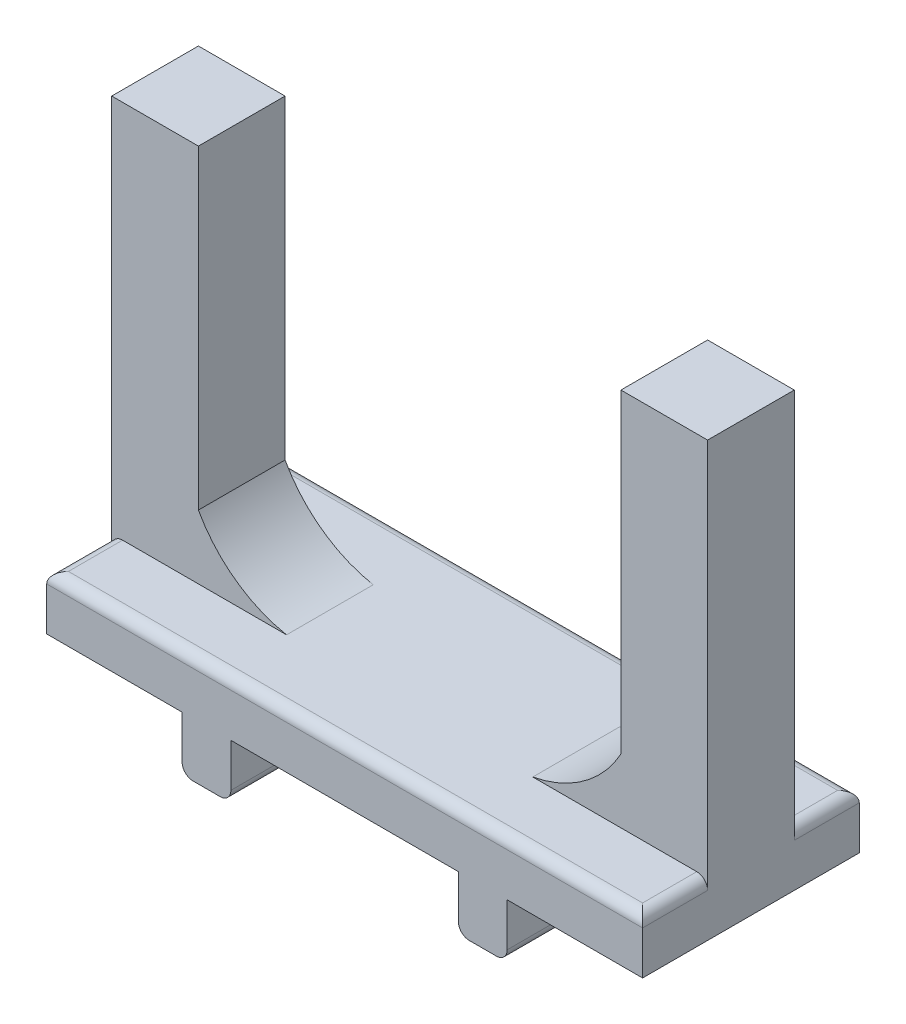
ISO-10303-21;
HEADER;
FILE_DESCRIPTION(('STEP AP214'),'2;1');
FILE_NAME('part.step','',(''),(''),'','','');
FILE_SCHEMA(('AUTOMOTIVE_DESIGN { 1 0 10303 214 1 1 1 1 }'));
ENDSEC;
DATA;
#1=APPLICATION_CONTEXT('core data for automotive mechanical design processes');
#2=APPLICATION_PROTOCOL_DEFINITION('international standard','automotive_design',2000,#1);
#3=PRODUCT_CONTEXT('',#1,'mechanical');
#4=PRODUCT('Part','Part','',(#3));
#5=PRODUCT_RELATED_PRODUCT_CATEGORY('part','',(#4));
#6=PRODUCT_DEFINITION_FORMATION('','',#4);
#7=PRODUCT_DEFINITION_CONTEXT('part definition',#1,'design');
#8=PRODUCT_DEFINITION('design','',#6,#7);
#9=PRODUCT_DEFINITION_SHAPE('','',#8);
#10=(LENGTH_UNIT() NAMED_UNIT(*) SI_UNIT(.MILLI.,.METRE.));
#11=(NAMED_UNIT(*) PLANE_ANGLE_UNIT() SI_UNIT($,.RADIAN.));
#12=(NAMED_UNIT(*) SI_UNIT($,.STERADIAN.) SOLID_ANGLE_UNIT());
#13=UNCERTAINTY_MEASURE_WITH_UNIT(LENGTH_MEASURE(1.E-05),#10,'distance_accuracy_value','');
#14=(GEOMETRIC_REPRESENTATION_CONTEXT(3) GLOBAL_UNCERTAINTY_ASSIGNED_CONTEXT((#13)) GLOBAL_UNIT_ASSIGNED_CONTEXT((#10,
#11,#12)) REPRESENTATION_CONTEXT('',''));
#15=CARTESIAN_POINT('',(0.,0.,0.));
#16=DIRECTION('',(0.,0.,1.));
#17=DIRECTION('',(1.,0.,0.));
#18=AXIS2_PLACEMENT_3D('',#15,#16,#17);
#19=CARTESIAN_POINT('',(0.,2.5,20.));
#20=DIRECTION('',(0.,1.,0.));
#21=DIRECTION('',(0.,0.,1.));
#22=AXIS2_PLACEMENT_3D('',#19,#20,#21);
#23=PLANE('',#22);
#24=DIRECTION('',(0.,0.,1.));
#25=VECTOR('',#24,1.);
#26=CARTESIAN_POINT('',(11.3640938890447,2.5,6.));
#27=LINE('',#26,#25);
#28=CARTESIAN_POINT('',(11.3640938890447,2.5,6.));
#29=VERTEX_POINT('',#28);
#30=CARTESIAN_POINT('',(11.3640938890447,2.5,14.));
#31=VERTEX_POINT('',#30);
#32=EDGE_CURVE('E242',#29,#31,#27,.T.);
#33=ORIENTED_EDGE('',*,*,#32,.F.);
#34=DIRECTION('',(-1.,0.,0.));
#35=VECTOR('',#34,1.);
#36=CARTESIAN_POINT('',(27.5,2.5,5.99999999999999));
#37=LINE('',#36,#35);
#38=CARTESIAN_POINT('',(26.5,2.5,5.99999999999999));
#39=VERTEX_POINT('',#38);
#40=EDGE_CURVE('E248',#39,#29,#37,.T.);
#41=ORIENTED_EDGE('',*,*,#40,.F.);
#42=DIRECTION('',(0.,0.,-1.));
#43=VECTOR('',#42,1.);
#44=CARTESIAN_POINT('',(26.5,2.5,20.));
#45=LINE('',#44,#43);
#46=CARTESIAN_POINT('',(26.5,2.5,1.));
#47=VERTEX_POINT('',#46);
#48=EDGE_CURVE('E435',#39,#47,#45,.T.);
#49=ORIENTED_EDGE('',*,*,#48,.T.);
#50=DIRECTION('',(1.,0.,0.));
#51=VECTOR('',#50,1.);
#52=CARTESIAN_POINT('',(-27.5,2.5,1.));
#53=LINE('',#52,#51);
#54=CARTESIAN_POINT('',(-26.5,2.5,1.));
#55=VERTEX_POINT('',#54);
#56=EDGE_CURVE('E433',#47,#55,#53,.F.);
#57=ORIENTED_EDGE('',*,*,#56,.T.);
#58=DIRECTION('',(0.,0.,-1.));
#59=VECTOR('',#58,1.);
#60=CARTESIAN_POINT('',(-26.5,2.5,6.));
#61=LINE('',#60,#59);
#62=CARTESIAN_POINT('',(-26.5,2.5,6.));
#63=VERTEX_POINT('',#62);
#64=EDGE_CURVE('E431',#55,#63,#61,.F.);
#65=ORIENTED_EDGE('',*,*,#64,.T.);
#66=DIRECTION('',(-1.,0.,0.));
#67=VECTOR('',#66,1.);
#68=CARTESIAN_POINT('',(-27.5,2.5,6.));
#69=LINE('',#68,#67);
#70=CARTESIAN_POINT('',(-11.3640938890447,2.5,6.));
#71=VERTEX_POINT('',#70);
#72=EDGE_CURVE('E57',#71,#63,#69,.T.);
#73=ORIENTED_EDGE('',*,*,#72,.F.);
#74=DIRECTION('',(0.,0.,1.));
#75=VECTOR('',#74,1.);
#76=CARTESIAN_POINT('',(-11.3640938890447,2.5,6.));
#77=LINE('',#76,#75);
#78=CARTESIAN_POINT('',(-11.3640938890447,2.5,14.));
#79=VERTEX_POINT('',#78);
#80=EDGE_CURVE('E275',#71,#79,#77,.T.);
#81=ORIENTED_EDGE('',*,*,#80,.T.);
#82=DIRECTION('',(1.,0.,0.));
#83=VECTOR('',#82,1.);
#84=CARTESIAN_POINT('',(-27.5,2.5,14.));
#85=LINE('',#84,#83);
#86=CARTESIAN_POINT('',(-26.5,2.5,14.));
#87=VERTEX_POINT('',#86);
#88=EDGE_CURVE('E64',#87,#79,#85,.T.);
#89=ORIENTED_EDGE('',*,*,#88,.F.);
#90=DIRECTION('',(0.,0.,-1.));
#91=VECTOR('',#90,1.);
#92=CARTESIAN_POINT('',(-26.5,2.5,20.));
#93=LINE('',#92,#91);
#94=CARTESIAN_POINT('',(-26.5,2.5,19.));
#95=VERTEX_POINT('',#94);
#96=EDGE_CURVE('E428',#87,#95,#93,.F.);
#97=ORIENTED_EDGE('',*,*,#96,.T.);
#98=DIRECTION('',(1.,0.,0.));
#99=VECTOR('',#98,1.);
#100=CARTESIAN_POINT('',(0.,2.5,19.));
#101=LINE('',#100,#99);
#102=CARTESIAN_POINT('',(26.5,2.5,19.));
#103=VERTEX_POINT('',#102);
#104=EDGE_CURVE('E426',#95,#103,#101,.T.);
#105=ORIENTED_EDGE('',*,*,#104,.T.);
#106=DIRECTION('',(0.,0.,-1.));
#107=VECTOR('',#106,1.);
#108=CARTESIAN_POINT('',(26.5,2.5,20.));
#109=LINE('',#108,#107);
#110=CARTESIAN_POINT('',(26.5,2.5,14.));
#111=VERTEX_POINT('',#110);
#112=EDGE_CURVE('E244',#103,#111,#109,.T.);
#113=ORIENTED_EDGE('',*,*,#112,.T.);
#114=DIRECTION('',(1.,0.,0.));
#115=VECTOR('',#114,1.);
#116=CARTESIAN_POINT('',(27.5,2.5,14.));
#117=LINE('',#116,#115);
#118=EDGE_CURVE('E239',#31,#111,#117,.T.);
#119=ORIENTED_EDGE('',*,*,#118,.F.);
#120=EDGE_LOOP('',(#33,#41,#49,#57,#65,#73,#81,#89,#97,#105,#113,#119));
#121=FACE_BOUND('',#120,.T.);
#122=ADVANCED_FACE('F40',(#121),#23,.T.);
#123=CARTESIAN_POINT('',(19.5,37.5,5.99999999999999));
#124=DIRECTION('',(1.,0.,0.));
#125=DIRECTION('',(0.,0.,-1.));
#126=AXIS2_PLACEMENT_3D('',#123,#124,#125);
#127=PLANE('',#126);
#128=DIRECTION('',(0.,0.,1.));
#129=VECTOR('',#128,1.);
#130=CARTESIAN_POINT('',(19.5,8.40506521265491,6.));
#131=LINE('',#130,#129);
#132=CARTESIAN_POINT('',(19.5,8.40506521265491,6.));
#133=VERTEX_POINT('',#132);
#134=CARTESIAN_POINT('',(19.5,8.40506521265491,14.));
#135=VERTEX_POINT('',#134);
#136=EDGE_CURVE('E258',#133,#135,#131,.T.);
#137=ORIENTED_EDGE('',*,*,#136,.T.);
#138=DIRECTION('',(0.,-1.,0.));
#139=VECTOR('',#138,1.);
#140=CARTESIAN_POINT('',(19.5,37.5,14.));
#141=LINE('',#140,#139);
#142=CARTESIAN_POINT('',(19.5,37.5,14.));
#143=VERTEX_POINT('',#142);
#144=EDGE_CURVE('E264',#143,#135,#141,.T.);
#145=ORIENTED_EDGE('',*,*,#144,.F.);
#146=DIRECTION('',(0.,0.,1.));
#147=VECTOR('',#146,1.);
#148=CARTESIAN_POINT('',(19.5,37.5,5.99999999999999));
#149=LINE('',#148,#147);
#150=CARTESIAN_POINT('',(19.5,37.5,5.99999999999999));
#151=VERTEX_POINT('',#150);
#152=EDGE_CURVE('E292',#151,#143,#149,.T.);
#153=ORIENTED_EDGE('',*,*,#152,.F.);
#154=DIRECTION('',(0.,-1.,0.));
#155=VECTOR('',#154,1.);
#156=CARTESIAN_POINT('',(19.5,37.5,5.99999999999999));
#157=LINE('',#156,#155);
#158=EDGE_CURVE('E282',#151,#133,#157,.T.);
#159=ORIENTED_EDGE('',*,*,#158,.T.);
#160=EDGE_LOOP('',(#137,#145,#153,#159));
#161=FACE_BOUND('',#160,.T.);
#162=ADVANCED_FACE('F500',(#161),#127,.F.);
#163=CARTESIAN_POINT('',(27.5,0.,20.));
#164=DIRECTION('',(1.,0.,0.));
#165=DIRECTION('',(0.,0.,-1.));
#166=AXIS2_PLACEMENT_3D('',#163,#164,#165);
#167=PLANE('',#166);
#168=DIRECTION('',(0.,-1.,0.));
#169=VECTOR('',#168,1.);
#170=CARTESIAN_POINT('',(27.5,0.,0.));
#171=LINE('',#170,#169);
#172=CARTESIAN_POINT('',(27.5,1.5,0.));
#173=VERTEX_POINT('',#172);
#174=CARTESIAN_POINT('',(27.5,-2.5,0.));
#175=VERTEX_POINT('',#174);
#176=EDGE_CURVE('E318',#173,#175,#171,.T.);
#177=ORIENTED_EDGE('',*,*,#176,.F.);
#178=DIRECTION('',(0.,0.,-1.));
#179=VECTOR('',#178,1.);
#180=CARTESIAN_POINT('',(27.5,1.5,20.));
#181=LINE('',#180,#179);
#182=CARTESIAN_POINT('',(27.5,1.5,5.99999999999999));
#183=VERTEX_POINT('',#182);
#184=EDGE_CURVE('E440',#173,#183,#181,.F.);
#185=ORIENTED_EDGE('',*,*,#184,.T.);
#186=DIRECTION('',(0.,-1.,0.));
#187=VECTOR('',#186,1.);
#188=CARTESIAN_POINT('',(27.5,37.5,5.99999999999999));
#189=LINE('',#188,#187);
#190=CARTESIAN_POINT('',(27.5,37.5,5.99999999999999));
#191=VERTEX_POINT('',#190);
#192=EDGE_CURVE('E280',#191,#183,#189,.T.);
#193=ORIENTED_EDGE('',*,*,#192,.F.);
#194=DIRECTION('',(0.,0.,-1.));
#195=VECTOR('',#194,1.);
#196=CARTESIAN_POINT('',(27.5,37.5,5.99999999999999));
#197=LINE('',#196,#195);
#198=CARTESIAN_POINT('',(27.5,37.5,14.));
#199=VERTEX_POINT('',#198);
#200=EDGE_CURVE('E249',#199,#191,#197,.T.);
#201=ORIENTED_EDGE('',*,*,#200,.F.);
#202=DIRECTION('',(0.,-1.,0.));
#203=VECTOR('',#202,1.);
#204=CARTESIAN_POINT('',(27.5,37.5,14.));
#205=LINE('',#204,#203);
#206=CARTESIAN_POINT('',(27.5,1.5,14.));
#207=VERTEX_POINT('',#206);
#208=EDGE_CURVE('E287',#199,#207,#205,.T.);
#209=ORIENTED_EDGE('',*,*,#208,.T.);
#210=DIRECTION('',(0.,0.,-1.));
#211=VECTOR('',#210,1.);
#212=CARTESIAN_POINT('',(27.5,1.5,20.));
#213=LINE('',#212,#211);
#214=CARTESIAN_POINT('',(27.5,1.5,20.));
#215=VERTEX_POINT('',#214);
#216=EDGE_CURVE('E438',#207,#215,#213,.F.);
#217=ORIENTED_EDGE('',*,*,#216,.T.);
#218=DIRECTION('',(0.,-1.,0.));
#219=VECTOR('',#218,1.);
#220=CARTESIAN_POINT('',(27.5,0.,20.));
#221=LINE('',#220,#219);
#222=CARTESIAN_POINT('',(27.5,-2.5,20.));
#223=VERTEX_POINT('',#222);
#224=EDGE_CURVE('E319',#215,#223,#221,.T.);
#225=ORIENTED_EDGE('',*,*,#224,.T.);
#226=DIRECTION('',(0.,0.,-1.));
#227=VECTOR('',#226,1.);
#228=CARTESIAN_POINT('',(27.5,-2.5,20.));
#229=LINE('',#228,#227);
#230=EDGE_CURVE('E370',#223,#175,#229,.T.);
#231=ORIENTED_EDGE('',*,*,#230,.T.);
#232=EDGE_LOOP('',(#177,#185,#193,#201,#209,#217,#225,#231));
#233=FACE_BOUND('',#232,.T.);
#234=ADVANCED_FACE('F489',(#233),#167,.T.);
#235=CARTESIAN_POINT('',(-27.5,0.,20.));
#236=DIRECTION('',(1.,0.,0.));
#237=DIRECTION('',(0.,0.,-1.));
#238=AXIS2_PLACEMENT_3D('',#235,#236,#237);
#239=PLANE('',#238);
#240=DIRECTION('',(0.,-1.,0.));
#241=VECTOR('',#240,1.);
#242=CARTESIAN_POINT('',(-27.5,37.5,6.));
#243=LINE('',#242,#241);
#244=CARTESIAN_POINT('',(-27.5,37.5,6.));
#245=VERTEX_POINT('',#244);
#246=CARTESIAN_POINT('',(-27.5,1.5,6.));
#247=VERTEX_POINT('',#246);
#248=EDGE_CURVE('E313',#245,#247,#243,.T.);
#249=ORIENTED_EDGE('',*,*,#248,.T.);
#250=DIRECTION('',(0.,0.,-1.));
#251=VECTOR('',#250,1.);
#252=CARTESIAN_POINT('',(-27.5,1.5,0.));
#253=LINE('',#252,#251);
#254=CARTESIAN_POINT('',(-27.5,1.5,0.));
#255=VERTEX_POINT('',#254);
#256=EDGE_CURVE('E446',#247,#255,#253,.T.);
#257=ORIENTED_EDGE('',*,*,#256,.T.);
#258=DIRECTION('',(0.,-1.,0.));
#259=VECTOR('',#258,1.);
#260=CARTESIAN_POINT('',(-27.5,0.,0.));
#261=LINE('',#260,#259);
#262=CARTESIAN_POINT('',(-27.5,-2.5,0.));
#263=VERTEX_POINT('',#262);
#264=EDGE_CURVE('E347',#255,#263,#261,.T.);
#265=ORIENTED_EDGE('',*,*,#264,.T.);
#266=DIRECTION('',(0.,0.,-1.));
#267=VECTOR('',#266,1.);
#268=CARTESIAN_POINT('',(-27.5,-2.5,20.));
#269=LINE('',#268,#267);
#270=CARTESIAN_POINT('',(-27.5,-2.5,20.));
#271=VERTEX_POINT('',#270);
#272=EDGE_CURVE('E383',#271,#263,#269,.T.);
#273=ORIENTED_EDGE('',*,*,#272,.F.);
#274=DIRECTION('',(0.,-1.,0.));
#275=VECTOR('',#274,1.);
#276=CARTESIAN_POINT('',(-27.5,0.,20.));
#277=LINE('',#276,#275);
#278=CARTESIAN_POINT('',(-27.5,1.5,20.));
#279=VERTEX_POINT('',#278);
#280=EDGE_CURVE('E321',#279,#271,#277,.T.);
#281=ORIENTED_EDGE('',*,*,#280,.F.);
#282=DIRECTION('',(0.,0.,-1.));
#283=VECTOR('',#282,1.);
#284=CARTESIAN_POINT('',(-27.5,1.5,14.));
#285=LINE('',#284,#283);
#286=CARTESIAN_POINT('',(-27.5,1.5,14.));
#287=VERTEX_POINT('',#286);
#288=EDGE_CURVE('E443',#279,#287,#285,.T.);
#289=ORIENTED_EDGE('',*,*,#288,.T.);
#290=DIRECTION('',(0.,-1.,0.));
#291=VECTOR('',#290,1.);
#292=CARTESIAN_POINT('',(-27.5,37.5,14.));
#293=LINE('',#292,#291);
#294=CARTESIAN_POINT('',(-27.5,37.5,14.));
#295=VERTEX_POINT('',#294);
#296=EDGE_CURVE('E311',#295,#287,#293,.T.);
#297=ORIENTED_EDGE('',*,*,#296,.F.);
#298=DIRECTION('',(0.,0.,1.));
#299=VECTOR('',#298,1.);
#300=CARTESIAN_POINT('',(-27.5,37.5,6.));
#301=LINE('',#300,#299);
#302=EDGE_CURVE('E303',#245,#295,#301,.T.);
#303=ORIENTED_EDGE('',*,*,#302,.F.);
#304=EDGE_LOOP('',(#249,#257,#265,#273,#281,#289,#297,#303));
#305=FACE_BOUND('',#304,.T.);
#306=ADVANCED_FACE('F474',(#305),#239,.F.);
#307=CARTESIAN_POINT('',(0.,-2.5,20.));
#308=DIRECTION('',(0.,1.,0.));
#309=DIRECTION('',(0.,0.,1.));
#310=AXIS2_PLACEMENT_3D('',#307,#308,#309);
#311=PLANE('',#310);
#312=DIRECTION('',(1.,0.,0.));
#313=VECTOR('',#312,1.);
#314=CARTESIAN_POINT('',(0.,-2.5,0.));
#315=LINE('',#314,#313);
#316=CARTESIAN_POINT('',(-15.,-2.5,0.));
#317=VERTEX_POINT('',#316);
#318=EDGE_CURVE('E349',#263,#317,#315,.T.);
#319=ORIENTED_EDGE('',*,*,#318,.T.);
#320=DIRECTION('',(0.,0.,-1.));
#321=VECTOR('',#320,1.);
#322=CARTESIAN_POINT('',(-15.,-2.5,20.));
#323=LINE('',#322,#321);
#324=CARTESIAN_POINT('',(-15.,-2.5,20.));
#325=VERTEX_POINT('',#324);
#326=EDGE_CURVE('E380',#325,#317,#323,.T.);
#327=ORIENTED_EDGE('',*,*,#326,.F.);
#328=DIRECTION('',(1.,0.,0.));
#329=VECTOR('',#328,1.);
#330=CARTESIAN_POINT('',(0.,-2.5,20.));
#331=LINE('',#330,#329);
#332=EDGE_CURVE('E324',#271,#325,#331,.T.);
#333=ORIENTED_EDGE('',*,*,#332,.F.);
#334=ORIENTED_EDGE('',*,*,#272,.T.);
#335=EDGE_LOOP('',(#319,#327,#333,#334));
#336=FACE_BOUND('',#335,.T.);
#337=ADVANCED_FACE('F540',(#336),#311,.F.);
#338=CARTESIAN_POINT('',(-15.,0.,20.));
#339=DIRECTION('',(1.,0.,0.));
#340=DIRECTION('',(0.,0.,-1.));
#341=AXIS2_PLACEMENT_3D('',#338,#339,#340);
#342=PLANE('',#341);
#343=DIRECTION('',(0.,-1.,0.));
#344=VECTOR('',#343,1.);
#345=CARTESIAN_POINT('',(-15.,0.,0.));
#346=LINE('',#345,#344);
#347=CARTESIAN_POINT('',(-15.,-6.5,0.));
#348=VERTEX_POINT('',#347);
#349=EDGE_CURVE('E351',#317,#348,#346,.T.);
#350=ORIENTED_EDGE('',*,*,#349,.T.);
#351=DIRECTION('',(0.,0.,-1.));
#352=VECTOR('',#351,1.);
#353=CARTESIAN_POINT('',(-15.,-6.5,20.));
#354=LINE('',#353,#352);
#355=CARTESIAN_POINT('',(-15.,-6.5,20.));
#356=VERTEX_POINT('',#355);
#357=EDGE_CURVE('E424',#348,#356,#354,.F.);
#358=ORIENTED_EDGE('',*,*,#357,.T.);
#359=DIRECTION('',(0.,-1.,0.));
#360=VECTOR('',#359,1.);
#361=CARTESIAN_POINT('',(-15.,0.,20.));
#362=LINE('',#361,#360);
#363=EDGE_CURVE('E326',#325,#356,#362,.T.);
#364=ORIENTED_EDGE('',*,*,#363,.F.);
#365=ORIENTED_EDGE('',*,*,#326,.T.);
#366=EDGE_LOOP('',(#350,#358,#364,#365));
#367=FACE_BOUND('',#366,.T.);
#368=ADVANCED_FACE('F543',(#367),#342,.F.);
#369=CARTESIAN_POINT('',(0.,-7.5,20.));
#370=DIRECTION('',(0.,1.,0.));
#371=DIRECTION('',(-1.,0.,0.));
#372=AXIS2_PLACEMENT_3D('',#369,#370,#371);
#373=PLANE('',#372);
#374=DIRECTION('',(1.,0.,0.));
#375=VECTOR('',#374,1.);
#376=CARTESIAN_POINT('',(0.,-7.5,0.));
#377=LINE('',#376,#375);
#378=CARTESIAN_POINT('',(-14.,-7.5,0.));
#379=VERTEX_POINT('',#378);
#380=CARTESIAN_POINT('',(-11.5,-7.5,0.));
#381=VERTEX_POINT('',#380);
#382=EDGE_CURVE('E355',#379,#381,#377,.T.);
#383=ORIENTED_EDGE('',*,*,#382,.T.);
#384=DIRECTION('',(0.,0.,-1.));
#385=VECTOR('',#384,1.);
#386=CARTESIAN_POINT('',(-11.5,-7.5,20.));
#387=LINE('',#386,#385);
#388=CARTESIAN_POINT('',(-11.5,-7.5,20.));
#389=VERTEX_POINT('',#388);
#390=EDGE_CURVE('E402',#381,#389,#387,.F.);
#391=ORIENTED_EDGE('',*,*,#390,.T.);
#392=DIRECTION('',(1.,0.,0.));
#393=VECTOR('',#392,1.);
#394=CARTESIAN_POINT('',(0.,-7.5,20.));
#395=LINE('',#394,#393);
#396=CARTESIAN_POINT('',(-14.,-7.5,20.));
#397=VERTEX_POINT('',#396);
#398=EDGE_CURVE('E331',#397,#389,#395,.T.);
#399=ORIENTED_EDGE('',*,*,#398,.F.);
#400=DIRECTION('',(0.,0.,-1.));
#401=VECTOR('',#400,1.);
#402=CARTESIAN_POINT('',(-14.,-7.5,20.));
#403=LINE('',#402,#401);
#404=EDGE_CURVE('E399',#397,#379,#403,.T.);
#405=ORIENTED_EDGE('',*,*,#404,.T.);
#406=EDGE_LOOP('',(#383,#391,#399,#405));
#407=FACE_BOUND('',#406,.T.);
#408=ADVANCED_FACE('F552',(#407),#373,.F.);
#409=CARTESIAN_POINT('',(-10.5,0.,20.));
#410=DIRECTION('',(1.,0.,0.));
#411=DIRECTION('',(0.,0.,-1.));
#412=AXIS2_PLACEMENT_3D('',#409,#410,#411);
#413=PLANE('',#412);
#414=DIRECTION('',(0.,-1.,0.));
#415=VECTOR('',#414,1.);
#416=CARTESIAN_POINT('',(-10.5,0.,20.));
#417=LINE('',#416,#415);
#418=CARTESIAN_POINT('',(-10.5,-2.5,20.));
#419=VERTEX_POINT('',#418);
#420=CARTESIAN_POINT('',(-10.5,-6.5,20.));
#421=VERTEX_POINT('',#420);
#422=EDGE_CURVE('E334',#419,#421,#417,.T.);
#423=ORIENTED_EDGE('',*,*,#422,.T.);
#424=DIRECTION('',(0.,0.,-1.));
#425=VECTOR('',#424,1.);
#426=CARTESIAN_POINT('',(-10.5,-6.5,0.));
#427=LINE('',#426,#425);
#428=CARTESIAN_POINT('',(-10.5,-6.5,0.));
#429=VERTEX_POINT('',#428);
#430=EDGE_CURVE('E386',#421,#429,#427,.T.);
#431=ORIENTED_EDGE('',*,*,#430,.T.);
#432=DIRECTION('',(0.,-1.,0.));
#433=VECTOR('',#432,1.);
#434=CARTESIAN_POINT('',(-10.5,0.,0.));
#435=LINE('',#434,#433);
#436=CARTESIAN_POINT('',(-10.5,-2.5,0.));
#437=VERTEX_POINT('',#436);
#438=EDGE_CURVE('E358',#437,#429,#435,.T.);
#439=ORIENTED_EDGE('',*,*,#438,.F.);
#440=DIRECTION('',(0.,0.,-1.));
#441=VECTOR('',#440,1.);
#442=CARTESIAN_POINT('',(-10.5,-2.5,20.));
#443=LINE('',#442,#441);
#444=EDGE_CURVE('E378',#419,#437,#443,.T.);
#445=ORIENTED_EDGE('',*,*,#444,.F.);
#446=EDGE_LOOP('',(#423,#431,#439,#445));
#447=FACE_BOUND('',#446,.T.);
#448=ADVANCED_FACE('F561',(#447),#413,.T.);
#449=CARTESIAN_POINT('',(10.5,-2.5,0.));
#450=VERTEX_POINT('',#449);
#451=EDGE_CURVE('E352',#437,#450,#315,.T.);
#452=ORIENTED_EDGE('',*,*,#451,.T.);
#453=DIRECTION('',(0.,0.,-1.));
#454=VECTOR('',#453,1.);
#455=CARTESIAN_POINT('',(10.5,-2.5,20.));
#456=LINE('',#455,#454);
#457=CARTESIAN_POINT('',(10.5,-2.5,20.));
#458=VERTEX_POINT('',#457);
#459=EDGE_CURVE('E375',#458,#450,#456,.T.);
#460=ORIENTED_EDGE('',*,*,#459,.F.);
#461=EDGE_CURVE('E328',#419,#458,#331,.T.);
#462=ORIENTED_EDGE('',*,*,#461,.F.);
#463=ORIENTED_EDGE('',*,*,#444,.T.);
#464=EDGE_LOOP('',(#452,#460,#462,#463));
#465=FACE_BOUND('',#464,.T.);
#466=ADVANCED_FACE('F568',(#465),#311,.F.);
#467=CARTESIAN_POINT('',(10.5,0.,20.));
#468=DIRECTION('',(1.,0.,0.));
#469=DIRECTION('',(0.,0.,-1.));
#470=AXIS2_PLACEMENT_3D('',#467,#468,#469);
#471=PLANE('',#470);
#472=DIRECTION('',(0.,-1.,0.));
#473=VECTOR('',#472,1.);
#474=CARTESIAN_POINT('',(10.5,0.,0.));
#475=LINE('',#474,#473);
#476=CARTESIAN_POINT('',(10.5,-6.5,0.));
#477=VERTEX_POINT('',#476);
#478=EDGE_CURVE('E361',#450,#477,#475,.T.);
#479=ORIENTED_EDGE('',*,*,#478,.T.);
#480=DIRECTION('',(0.,0.,-1.));
#481=VECTOR('',#480,1.);
#482=CARTESIAN_POINT('',(10.5,-6.5,20.));
#483=LINE('',#482,#481);
#484=CARTESIAN_POINT('',(10.5,-6.5,20.));
#485=VERTEX_POINT('',#484);
#486=EDGE_CURVE('E419',#477,#485,#483,.F.);
#487=ORIENTED_EDGE('',*,*,#486,.T.);
#488=DIRECTION('',(0.,-1.,0.));
#489=VECTOR('',#488,1.);
#490=CARTESIAN_POINT('',(10.5,0.,20.));
#491=LINE('',#490,#489);
#492=EDGE_CURVE('E337',#458,#485,#491,.T.);
#493=ORIENTED_EDGE('',*,*,#492,.F.);
#494=ORIENTED_EDGE('',*,*,#459,.T.);
#495=EDGE_LOOP('',(#479,#487,#493,#494));
#496=FACE_BOUND('',#495,.T.);
#497=ADVANCED_FACE('F571',(#496),#471,.F.);
#498=CARTESIAN_POINT('',(0.,-7.5,20.));
#499=DIRECTION('',(0.,1.,0.));
#500=DIRECTION('',(0.,0.,1.));
#501=AXIS2_PLACEMENT_3D('',#498,#499,#500);
#502=PLANE('',#501);
#503=DIRECTION('',(1.,0.,0.));
#504=VECTOR('',#503,1.);
#505=CARTESIAN_POINT('',(0.,-7.5,20.));
#506=LINE('',#505,#504);
#507=CARTESIAN_POINT('',(11.5,-7.5,20.));
#508=VERTEX_POINT('',#507);
#509=CARTESIAN_POINT('',(14.,-7.5,20.));
#510=VERTEX_POINT('',#509);
#511=EDGE_CURVE('E340',#508,#510,#506,.T.);
#512=ORIENTED_EDGE('',*,*,#511,.F.);
#513=DIRECTION('',(0.,0.,-1.));
#514=VECTOR('',#513,1.);
#515=CARTESIAN_POINT('',(11.5,-7.5,20.));
#516=LINE('',#515,#514);
#517=CARTESIAN_POINT('',(11.5,-7.5,0.));
#518=VERTEX_POINT('',#517);
#519=EDGE_CURVE('E416',#508,#518,#516,.T.);
#520=ORIENTED_EDGE('',*,*,#519,.T.);
#521=DIRECTION('',(1.,0.,0.));
#522=VECTOR('',#521,1.);
#523=CARTESIAN_POINT('',(0.,-7.5,0.));
#524=LINE('',#523,#522);
#525=CARTESIAN_POINT('',(14.,-7.5,0.));
#526=VERTEX_POINT('',#525);
#527=EDGE_CURVE('E364',#518,#526,#524,.T.);
#528=ORIENTED_EDGE('',*,*,#527,.T.);
#529=DIRECTION('',(0.,0.,-1.));
#530=VECTOR('',#529,1.);
#531=CARTESIAN_POINT('',(14.,-7.5,20.));
#532=LINE('',#531,#530);
#533=EDGE_CURVE('E414',#526,#510,#532,.F.);
#534=ORIENTED_EDGE('',*,*,#533,.T.);
#535=EDGE_LOOP('',(#512,#520,#528,#534));
#536=FACE_BOUND('',#535,.T.);
#537=ADVANCED_FACE('F579',(#536),#502,.F.);
#538=CARTESIAN_POINT('',(15.,0.,20.));
#539=DIRECTION('',(1.,0.,0.));
#540=DIRECTION('',(0.,0.,-1.));
#541=AXIS2_PLACEMENT_3D('',#538,#539,#540);
#542=PLANE('',#541);
#543=DIRECTION('',(0.,-1.,0.));
#544=VECTOR('',#543,1.);
#545=CARTESIAN_POINT('',(15.,0.,20.));
#546=LINE('',#545,#544);
#547=CARTESIAN_POINT('',(15.,-2.5,20.));
#548=VERTEX_POINT('',#547);
#549=CARTESIAN_POINT('',(15.,-6.5,20.));
#550=VERTEX_POINT('',#549);
#551=EDGE_CURVE('E343',#548,#550,#546,.T.);
#552=ORIENTED_EDGE('',*,*,#551,.T.);
#553=DIRECTION('',(0.,0.,-1.));
#554=VECTOR('',#553,1.);
#555=CARTESIAN_POINT('',(15.,-6.5,0.));
#556=LINE('',#555,#554);
#557=CARTESIAN_POINT('',(15.,-6.5,0.));
#558=VERTEX_POINT('',#557);
#559=EDGE_CURVE('E421',#550,#558,#556,.T.);
#560=ORIENTED_EDGE('',*,*,#559,.T.);
#561=DIRECTION('',(0.,-1.,0.));
#562=VECTOR('',#561,1.);
#563=CARTESIAN_POINT('',(15.,0.,0.));
#564=LINE('',#563,#562);
#565=CARTESIAN_POINT('',(15.,-2.5,0.));
#566=VERTEX_POINT('',#565);
#567=EDGE_CURVE('E367',#566,#558,#564,.T.);
#568=ORIENTED_EDGE('',*,*,#567,.F.);
#569=DIRECTION('',(0.,0.,-1.));
#570=VECTOR('',#569,1.);
#571=CARTESIAN_POINT('',(15.,-2.5,20.));
#572=LINE('',#571,#570);
#573=EDGE_CURVE('E373',#548,#566,#572,.T.);
#574=ORIENTED_EDGE('',*,*,#573,.F.);
#575=EDGE_LOOP('',(#552,#560,#568,#574));
#576=FACE_BOUND('',#575,.T.);
#577=ADVANCED_FACE('F586',(#576),#542,.T.);
#578=EDGE_CURVE('E322',#566,#175,#315,.T.);
#579=ORIENTED_EDGE('',*,*,#578,.T.);
#580=ORIENTED_EDGE('',*,*,#230,.F.);
#581=EDGE_CURVE('E327',#548,#223,#331,.T.);
#582=ORIENTED_EDGE('',*,*,#581,.F.);
#583=ORIENTED_EDGE('',*,*,#573,.T.);
#584=EDGE_LOOP('',(#579,#580,#582,#583));
#585=FACE_BOUND('',#584,.T.);
#586=ADVANCED_FACE('F590',(#585),#311,.F.);
#587=CARTESIAN_POINT('',(0.,0.,20.));
#588=DIRECTION('',(0.,0.,1.));
#589=DIRECTION('',(1.,0.,0.));
#590=AXIS2_PLACEMENT_3D('',#587,#588,#589);
#591=PLANE('',#590);
#592=ORIENTED_EDGE('',*,*,#398,.T.);
#593=CARTESIAN_POINT('',(-11.5,-6.5,20.));
#594=DIRECTION('',(0.,0.,1.));
#595=DIRECTION('',(1.,0.,0.));
#596=AXIS2_PLACEMENT_3D('',#593,#594,#595);
#597=CIRCLE('',#596,1.);
#598=EDGE_CURVE('E412',#389,#421,#597,.T.);
#599=ORIENTED_EDGE('',*,*,#598,.T.);
#600=ORIENTED_EDGE('',*,*,#422,.F.);
#601=ORIENTED_EDGE('',*,*,#461,.T.);
#602=ORIENTED_EDGE('',*,*,#492,.T.);
#603=CARTESIAN_POINT('',(11.5,-6.5,20.));
#604=DIRECTION('',(0.,0.,1.));
#605=DIRECTION('',(1.,0.,0.));
#606=AXIS2_PLACEMENT_3D('',#603,#604,#605);
#607=CIRCLE('',#606,1.);
#608=EDGE_CURVE('E410',#485,#508,#607,.T.);
#609=ORIENTED_EDGE('',*,*,#608,.T.);
#610=ORIENTED_EDGE('',*,*,#511,.T.);
#611=CARTESIAN_POINT('',(14.,-6.5,20.));
#612=DIRECTION('',(0.,0.,1.));
#613=DIRECTION('',(1.,0.,0.));
#614=AXIS2_PLACEMENT_3D('',#611,#612,#613);
#615=CIRCLE('',#614,1.);
#616=EDGE_CURVE('E408',#510,#550,#615,.T.);
#617=ORIENTED_EDGE('',*,*,#616,.T.);
#618=ORIENTED_EDGE('',*,*,#551,.F.);
#619=ORIENTED_EDGE('',*,*,#581,.T.);
#620=ORIENTED_EDGE('',*,*,#224,.F.);
#621=DIRECTION('',(1.,0.,0.));
#622=VECTOR('',#621,1.);
#623=CARTESIAN_POINT('',(0.,1.5,20.));
#624=LINE('',#623,#622);
#625=EDGE_CURVE('E404',#215,#279,#624,.F.);
#626=ORIENTED_EDGE('',*,*,#625,.T.);
#627=ORIENTED_EDGE('',*,*,#280,.T.);
#628=ORIENTED_EDGE('',*,*,#332,.T.);
#629=ORIENTED_EDGE('',*,*,#363,.T.);
#630=CARTESIAN_POINT('',(-14.,-6.5,20.));
#631=DIRECTION('',(0.,0.,1.));
#632=DIRECTION('',(1.,0.,0.));
#633=AXIS2_PLACEMENT_3D('',#630,#631,#632);
#634=CIRCLE('',#633,1.);
#635=EDGE_CURVE('E406',#356,#397,#634,.T.);
#636=ORIENTED_EDGE('',*,*,#635,.T.);
#637=EDGE_LOOP('',(#592,#599,#600,#601,#602,#609,#610,#617,#618,#619,#620,#626,#627,#628,#629,#636));
#638=FACE_BOUND('',#637,.T.);
#639=ADVANCED_FACE('F480',(#638),#591,.T.);
#640=CARTESIAN_POINT('',(0.,0.,0.));
#641=DIRECTION('',(0.,0.,1.));
#642=DIRECTION('',(1.,0.,0.));
#643=AXIS2_PLACEMENT_3D('',#640,#641,#642);
#644=PLANE('',#643);
#645=ORIENTED_EDGE('',*,*,#438,.T.);
#646=CARTESIAN_POINT('',(-11.5,-6.5,0.));
#647=DIRECTION('',(0.,0.,1.));
#648=DIRECTION('',(1.,0.,0.));
#649=AXIS2_PLACEMENT_3D('',#646,#647,#648);
#650=CIRCLE('',#649,1.);
#651=EDGE_CURVE('E397',#429,#381,#650,.F.);
#652=ORIENTED_EDGE('',*,*,#651,.T.);
#653=ORIENTED_EDGE('',*,*,#382,.F.);
#654=CARTESIAN_POINT('',(-14.,-6.5,0.));
#655=DIRECTION('',(0.,0.,1.));
#656=DIRECTION('',(1.,0.,0.));
#657=AXIS2_PLACEMENT_3D('',#654,#655,#656);
#658=CIRCLE('',#657,1.);
#659=EDGE_CURVE('E391',#379,#348,#658,.F.);
#660=ORIENTED_EDGE('',*,*,#659,.T.);
#661=ORIENTED_EDGE('',*,*,#349,.F.);
#662=ORIENTED_EDGE('',*,*,#318,.F.);
#663=ORIENTED_EDGE('',*,*,#264,.F.);
#664=DIRECTION('',(1.,0.,0.));
#665=VECTOR('',#664,1.);
#666=CARTESIAN_POINT('',(27.5,1.5,0.));
#667=LINE('',#666,#665);
#668=EDGE_CURVE('E389',#255,#173,#667,.T.);
#669=ORIENTED_EDGE('',*,*,#668,.T.);
#670=ORIENTED_EDGE('',*,*,#176,.T.);
#671=ORIENTED_EDGE('',*,*,#578,.F.);
#672=ORIENTED_EDGE('',*,*,#567,.T.);
#673=CARTESIAN_POINT('',(14.,-6.5,0.));
#674=DIRECTION('',(0.,0.,1.));
#675=DIRECTION('',(1.,0.,0.));
#676=AXIS2_PLACEMENT_3D('',#673,#674,#675);
#677=CIRCLE('',#676,1.);
#678=EDGE_CURVE('E393',#558,#526,#677,.F.);
#679=ORIENTED_EDGE('',*,*,#678,.T.);
#680=ORIENTED_EDGE('',*,*,#527,.F.);
#681=CARTESIAN_POINT('',(11.5,-6.5,0.));
#682=DIRECTION('',(0.,0.,1.));
#683=DIRECTION('',(1.,0.,0.));
#684=AXIS2_PLACEMENT_3D('',#681,#682,#683);
#685=CIRCLE('',#684,1.);
#686=EDGE_CURVE('E395',#518,#477,#685,.F.);
#687=ORIENTED_EDGE('',*,*,#686,.T.);
#688=ORIENTED_EDGE('',*,*,#478,.F.);
#689=ORIENTED_EDGE('',*,*,#451,.F.);
#690=EDGE_LOOP('',(#645,#652,#653,#660,#661,#662,#663,#669,#670,#671,#672,#679,#680,#687,#688,#689));
#691=FACE_BOUND('',#690,.T.);
#692=ADVANCED_FACE('F537',(#691),#644,.F.);
#693=CARTESIAN_POINT('',(-19.5,37.5,6.));
#694=DIRECTION('',(-1.,0.,0.));
#695=DIRECTION('',(0.,0.,1.));
#696=AXIS2_PLACEMENT_3D('',#693,#694,#695);
#697=PLANE('',#696);
#698=DIRECTION('',(0.,-1.,0.));
#699=VECTOR('',#698,1.);
#700=CARTESIAN_POINT('',(-19.5,37.5,14.));
#701=LINE('',#700,#699);
#702=CARTESIAN_POINT('',(-19.5,37.5,14.));
#703=VERTEX_POINT('',#702);
#704=CARTESIAN_POINT('',(-19.5,8.4050652126549,14.));
#705=VERTEX_POINT('',#704);
#706=EDGE_CURVE('E307',#703,#705,#701,.T.);
#707=ORIENTED_EDGE('',*,*,#706,.T.);
#708=DIRECTION('',(0.,0.,1.));
#709=VECTOR('',#708,1.);
#710=CARTESIAN_POINT('',(-19.5,8.40506521265491,6.));
#711=LINE('',#710,#709);
#712=CARTESIAN_POINT('',(-19.5,8.4050652126549,6.));
#713=VERTEX_POINT('',#712);
#714=EDGE_CURVE('E274',#713,#705,#711,.T.);
#715=ORIENTED_EDGE('',*,*,#714,.F.);
#716=DIRECTION('',(0.,-1.,0.));
#717=VECTOR('',#716,1.);
#718=CARTESIAN_POINT('',(-19.5,37.5,6.));
#719=LINE('',#718,#717);
#720=CARTESIAN_POINT('',(-19.5,37.5,6.));
#721=VERTEX_POINT('',#720);
#722=EDGE_CURVE('E315',#721,#713,#719,.T.);
#723=ORIENTED_EDGE('',*,*,#722,.F.);
#724=DIRECTION('',(0.,0.,-1.));
#725=VECTOR('',#724,1.);
#726=CARTESIAN_POINT('',(-19.5,37.5,6.));
#727=LINE('',#726,#725);
#728=EDGE_CURVE('E298',#703,#721,#727,.T.);
#729=ORIENTED_EDGE('',*,*,#728,.F.);
#730=EDGE_LOOP('',(#707,#715,#723,#729));
#731=FACE_BOUND('',#730,.T.);
#732=ADVANCED_FACE('F531',(#731),#697,.F.);
#733=CARTESIAN_POINT('',(-27.5,37.5,6.));
#734=DIRECTION('',(0.,0.,1.));
#735=DIRECTION('',(1.,0.,0.));
#736=AXIS2_PLACEMENT_3D('',#733,#734,#735);
#737=PLANE('',#736);
#738=ORIENTED_EDGE('',*,*,#72,.T.);
#739=CARTESIAN_POINT('',(-26.5,1.5,6.));
#740=DIRECTION('',(0.,0.,1.));
#741=DIRECTION('',(1.,0.,0.));
#742=AXIS2_PLACEMENT_3D('',#739,#740,#741);
#743=CIRCLE('',#742,1.);
#744=EDGE_CURVE('E49',#63,#247,#743,.T.);
#745=ORIENTED_EDGE('',*,*,#744,.T.);
#746=ORIENTED_EDGE('',*,*,#248,.F.);
#747=DIRECTION('',(-1.,0.,0.));
#748=VECTOR('',#747,1.);
#749=CARTESIAN_POINT('',(-27.5,37.5,6.));
#750=LINE('',#749,#748);
#751=EDGE_CURVE('E301',#721,#245,#750,.T.);
#752=ORIENTED_EDGE('',*,*,#751,.F.);
#753=ORIENTED_EDGE('',*,*,#722,.T.);
#754=CARTESIAN_POINT('',(-9.15825791238478,14.0964606049589,6.));
#755=DIRECTION('',(0.,0.,-1.));
#756=DIRECTION('',(1.,0.,0.));
#757=AXIS2_PLACEMENT_3D('',#754,#755,#756);
#758=CIRCLE('',#757,11.8043894767282);
#759=EDGE_CURVE('E271',#71,#713,#758,.T.);
#760=ORIENTED_EDGE('',*,*,#759,.F.);
#761=EDGE_LOOP('',(#738,#745,#746,#752,#753,#760));
#762=FACE_BOUND('',#761,.T.);
#763=ADVANCED_FACE('F521',(#762),#737,.F.);
#764=CARTESIAN_POINT('',(-27.5,37.5,14.));
#765=DIRECTION('',(0.,0.,-1.));
#766=DIRECTION('',(-1.,0.,0.));
#767=AXIS2_PLACEMENT_3D('',#764,#765,#766);
#768=PLANE('',#767);
#769=ORIENTED_EDGE('',*,*,#296,.T.);
#770=CARTESIAN_POINT('',(-26.5,1.5,14.));
#771=DIRECTION('',(0.,0.,-1.));
#772=DIRECTION('',(-1.,0.,0.));
#773=AXIS2_PLACEMENT_3D('',#770,#771,#772);
#774=CIRCLE('',#773,1.);
#775=EDGE_CURVE('E11',#287,#87,#774,.T.);
#776=ORIENTED_EDGE('',*,*,#775,.T.);
#777=ORIENTED_EDGE('',*,*,#88,.T.);
#778=CARTESIAN_POINT('',(-9.15825791238478,14.0964606049589,14.));
#779=DIRECTION('',(0.,0.,-1.));
#780=DIRECTION('',(1.,0.,0.));
#781=AXIS2_PLACEMENT_3D('',#778,#779,#780);
#782=CIRCLE('',#781,11.8043894767282);
#783=EDGE_CURVE('E268',#79,#705,#782,.T.);
#784=ORIENTED_EDGE('',*,*,#783,.T.);
#785=ORIENTED_EDGE('',*,*,#706,.F.);
#786=DIRECTION('',(1.,0.,0.));
#787=VECTOR('',#786,1.);
#788=CARTESIAN_POINT('',(-27.5,37.5,14.));
#789=LINE('',#788,#787);
#790=EDGE_CURVE('E305',#295,#703,#789,.T.);
#791=ORIENTED_EDGE('',*,*,#790,.F.);
#792=EDGE_LOOP('',(#769,#776,#777,#784,#785,#791));
#793=FACE_BOUND('',#792,.T.);
#794=ADVANCED_FACE('F528',(#793),#768,.F.);
#795=CARTESIAN_POINT('',(0.,37.5,0.));
#796=DIRECTION('',(0.,1.,0.));
#797=DIRECTION('',(0.,0.,1.));
#798=AXIS2_PLACEMENT_3D('',#795,#796,#797);
#799=PLANE('',#798);
#800=ORIENTED_EDGE('',*,*,#728,.T.);
#801=ORIENTED_EDGE('',*,*,#751,.T.);
#802=ORIENTED_EDGE('',*,*,#302,.T.);
#803=ORIENTED_EDGE('',*,*,#790,.T.);
#804=EDGE_LOOP('',(#800,#801,#802,#803));
#805=FACE_BOUND('',#804,.T.);
#806=ADVANCED_FACE('F533',(#805),#799,.T.);
#807=CARTESIAN_POINT('',(27.5,37.5,5.99999999999999));
#808=DIRECTION('',(0.,0.,1.));
#809=DIRECTION('',(1.,0.,0.));
#810=AXIS2_PLACEMENT_3D('',#807,#808,#809);
#811=PLANE('',#810);
#812=ORIENTED_EDGE('',*,*,#192,.T.);
#813=CARTESIAN_POINT('',(26.5,1.5,5.99999999999999));
#814=DIRECTION('',(0.,0.,1.));
#815=DIRECTION('',(1.,0.,0.));
#816=AXIS2_PLACEMENT_3D('',#813,#814,#815);
#817=CIRCLE('',#816,1.);
#818=EDGE_CURVE('E448',#183,#39,#817,.T.);
#819=ORIENTED_EDGE('',*,*,#818,.T.);
#820=ORIENTED_EDGE('',*,*,#40,.T.);
#821=CARTESIAN_POINT('',(9.15825791238478,14.0964606049589,6.));
#822=DIRECTION('',(0.,0.,1.));
#823=DIRECTION('',(-1.,0.,0.));
#824=AXIS2_PLACEMENT_3D('',#821,#822,#823);
#825=CIRCLE('',#824,11.8043894767282);
#826=EDGE_CURVE('E257',#29,#133,#825,.T.);
#827=ORIENTED_EDGE('',*,*,#826,.T.);
#828=ORIENTED_EDGE('',*,*,#158,.F.);
#829=DIRECTION('',(-1.,0.,0.));
#830=VECTOR('',#829,1.);
#831=CARTESIAN_POINT('',(27.5,37.5,5.99999999999999));
#832=LINE('',#831,#830);
#833=EDGE_CURVE('E294',#191,#151,#832,.T.);
#834=ORIENTED_EDGE('',*,*,#833,.F.);
#835=EDGE_LOOP('',(#812,#819,#820,#827,#828,#834));
#836=FACE_BOUND('',#835,.T.);
#837=ADVANCED_FACE('F502',(#836),#811,.F.);
#838=CARTESIAN_POINT('',(27.5,37.5,14.));
#839=DIRECTION('',(0.,0.,-1.));
#840=DIRECTION('',(-1.,0.,0.));
#841=AXIS2_PLACEMENT_3D('',#838,#839,#840);
#842=PLANE('',#841);
#843=ORIENTED_EDGE('',*,*,#118,.T.);
#844=CARTESIAN_POINT('',(26.5,1.5,14.));
#845=DIRECTION('',(0.,0.,-1.));
#846=DIRECTION('',(-1.,0.,0.));
#847=AXIS2_PLACEMENT_3D('',#844,#845,#846);
#848=CIRCLE('',#847,1.);
#849=EDGE_CURVE('E450',#111,#207,#848,.T.);
#850=ORIENTED_EDGE('',*,*,#849,.T.);
#851=ORIENTED_EDGE('',*,*,#208,.F.);
#852=DIRECTION('',(1.,0.,0.));
#853=VECTOR('',#852,1.);
#854=CARTESIAN_POINT('',(27.5,37.5,14.));
#855=LINE('',#854,#853);
#856=EDGE_CURVE('E288',#143,#199,#855,.T.);
#857=ORIENTED_EDGE('',*,*,#856,.F.);
#858=ORIENTED_EDGE('',*,*,#144,.T.);
#859=CARTESIAN_POINT('',(9.15825791238478,14.0964606049589,14.));
#860=DIRECTION('',(0.,0.,1.));
#861=DIRECTION('',(-1.,0.,0.));
#862=AXIS2_PLACEMENT_3D('',#859,#860,#861);
#863=CIRCLE('',#862,11.8043894767282);
#864=EDGE_CURVE('E255',#31,#135,#863,.T.);
#865=ORIENTED_EDGE('',*,*,#864,.F.);
#866=EDGE_LOOP('',(#843,#850,#851,#857,#858,#865));
#867=FACE_BOUND('',#866,.T.);
#868=ADVANCED_FACE('F261',(#867),#842,.F.);
#869=CARTESIAN_POINT('',(0.,37.5,0.));
#870=DIRECTION('',(0.,-1.,0.));
#871=DIRECTION('',(0.,0.,-1.));
#872=AXIS2_PLACEMENT_3D('',#869,#870,#871);
#873=PLANE('',#872);
#874=ORIENTED_EDGE('',*,*,#200,.T.);
#875=ORIENTED_EDGE('',*,*,#833,.T.);
#876=ORIENTED_EDGE('',*,*,#152,.T.);
#877=ORIENTED_EDGE('',*,*,#856,.T.);
#878=EDGE_LOOP('',(#874,#875,#876,#877));
#879=FACE_BOUND('',#878,.T.);
#880=ADVANCED_FACE('F496',(#879),#873,.F.);
#881=CARTESIAN_POINT('',(-11.5,-6.5,20.));
#882=DIRECTION('',(0.,0.,1.));
#883=DIRECTION('',(1.,0.,0.));
#884=AXIS2_PLACEMENT_3D('',#881,#882,#883);
#885=CYLINDRICAL_SURFACE('',#884,1.);
#886=ORIENTED_EDGE('',*,*,#598,.F.);
#887=ORIENTED_EDGE('',*,*,#390,.F.);
#888=ORIENTED_EDGE('',*,*,#651,.F.);
#889=ORIENTED_EDGE('',*,*,#430,.F.);
#890=EDGE_LOOP('',(#886,#887,#888,#889));
#891=FACE_BOUND('',#890,.T.);
#892=ADVANCED_FACE('F559',(#891),#885,.T.);
#893=CARTESIAN_POINT('',(11.5,-6.5,20.));
#894=DIRECTION('',(0.,0.,-1.));
#895=DIRECTION('',(-1.,0.,0.));
#896=AXIS2_PLACEMENT_3D('',#893,#894,#895);
#897=CYLINDRICAL_SURFACE('',#896,1.);
#898=ORIENTED_EDGE('',*,*,#608,.F.);
#899=ORIENTED_EDGE('',*,*,#486,.F.);
#900=ORIENTED_EDGE('',*,*,#686,.F.);
#901=ORIENTED_EDGE('',*,*,#519,.F.);
#902=EDGE_LOOP('',(#898,#899,#900,#901));
#903=FACE_BOUND('',#902,.T.);
#904=ADVANCED_FACE('F574',(#903),#897,.T.);
#905=CARTESIAN_POINT('',(14.,-6.5,20.));
#906=DIRECTION('',(0.,0.,1.));
#907=DIRECTION('',(1.,0.,0.));
#908=AXIS2_PLACEMENT_3D('',#905,#906,#907);
#909=CYLINDRICAL_SURFACE('',#908,1.);
#910=ORIENTED_EDGE('',*,*,#616,.F.);
#911=ORIENTED_EDGE('',*,*,#533,.F.);
#912=ORIENTED_EDGE('',*,*,#678,.F.);
#913=ORIENTED_EDGE('',*,*,#559,.F.);
#914=EDGE_LOOP('',(#910,#911,#912,#913));
#915=FACE_BOUND('',#914,.T.);
#916=ADVANCED_FACE('F583',(#915),#909,.T.);
#917=CARTESIAN_POINT('',(-14.,-6.5,20.));
#918=DIRECTION('',(0.,0.,-1.));
#919=DIRECTION('',(-1.,0.,0.));
#920=AXIS2_PLACEMENT_3D('',#917,#918,#919);
#921=CYLINDRICAL_SURFACE('',#920,1.);
#922=ORIENTED_EDGE('',*,*,#635,.F.);
#923=ORIENTED_EDGE('',*,*,#357,.F.);
#924=ORIENTED_EDGE('',*,*,#659,.F.);
#925=ORIENTED_EDGE('',*,*,#404,.F.);
#926=EDGE_LOOP('',(#922,#923,#924,#925));
#927=FACE_BOUND('',#926,.T.);
#928=ADVANCED_FACE('F549',(#927),#921,.T.);
#929=CARTESIAN_POINT('',(-26.5,1.5,20.));
#930=DIRECTION('',(0.,0.,1.));
#931=DIRECTION('',(1.,0.,0.));
#932=AXIS2_PLACEMENT_3D('',#929,#930,#931);
#933=CYLINDRICAL_SURFACE('',#932,1.);
#934=ORIENTED_EDGE('',*,*,#744,.F.);
#935=ORIENTED_EDGE('',*,*,#64,.F.);
#936=CARTESIAN_POINT('',(-26.5,1.5,1.));
#937=DIRECTION('',(-0.707106781186547,0.,0.707106781186547));
#938=DIRECTION('',(0.707106781186547,0.,0.707106781186547));
#939=AXIS2_PLACEMENT_3D('',#936,#937,#938);
#940=ELLIPSE('',#939,1.41421356237309,1.);
#941=EDGE_CURVE('E283',#255,#55,#940,.F.);
#942=ORIENTED_EDGE('',*,*,#941,.F.);
#943=ORIENTED_EDGE('',*,*,#256,.F.);
#944=EDGE_LOOP('',(#934,#935,#942,#943));
#945=FACE_BOUND('',#944,.T.);
#946=ADVANCED_FACE('F517',(#945),#933,.T.);
#947=CARTESIAN_POINT('',(0.,1.5,1.));
#948=DIRECTION('',(-1.,0.,0.));
#949=DIRECTION('',(0.,0.,1.));
#950=AXIS2_PLACEMENT_3D('',#947,#948,#949);
#951=CYLINDRICAL_SURFACE('',#950,1.);
#952=ORIENTED_EDGE('',*,*,#941,.T.);
#953=ORIENTED_EDGE('',*,*,#56,.F.);
#954=CARTESIAN_POINT('',(26.5,1.5,1.));
#955=DIRECTION('',(-0.707106781186547,0.,-0.707106781186547));
#956=DIRECTION('',(-0.707106781186547,0.,0.707106781186547));
#957=AXIS2_PLACEMENT_3D('',#954,#955,#956);
#958=ELLIPSE('',#957,1.41421356237309,1.);
#959=EDGE_CURVE('E454',#173,#47,#958,.F.);
#960=ORIENTED_EDGE('',*,*,#959,.F.);
#961=ORIENTED_EDGE('',*,*,#668,.F.);
#962=EDGE_LOOP('',(#952,#953,#960,#961));
#963=FACE_BOUND('',#962,.T.);
#964=ADVANCED_FACE('F512',(#963),#951,.T.);
#965=CARTESIAN_POINT('',(26.5,1.5,20.));
#966=DIRECTION('',(0.,0.,-1.));
#967=DIRECTION('',(-1.,0.,0.));
#968=AXIS2_PLACEMENT_3D('',#965,#966,#967);
#969=CYLINDRICAL_SURFACE('',#968,1.);
#970=ORIENTED_EDGE('',*,*,#818,.F.);
#971=ORIENTED_EDGE('',*,*,#184,.F.);
#972=ORIENTED_EDGE('',*,*,#959,.T.);
#973=ORIENTED_EDGE('',*,*,#48,.F.);
#974=EDGE_LOOP('',(#970,#971,#972,#973));
#975=FACE_BOUND('',#974,.T.);
#976=ADVANCED_FACE('F506',(#975),#969,.T.);
#977=CARTESIAN_POINT('',(-26.5,1.5,20.));
#978=DIRECTION('',(0.,0.,1.));
#979=DIRECTION('',(1.,0.,0.));
#980=AXIS2_PLACEMENT_3D('',#977,#978,#979);
#981=CYLINDRICAL_SURFACE('',#980,1.);
#982=ORIENTED_EDGE('',*,*,#775,.F.);
#983=ORIENTED_EDGE('',*,*,#288,.F.);
#984=CARTESIAN_POINT('',(-26.5,1.5,19.));
#985=DIRECTION('',(0.707106781186547,0.,0.707106781186547));
#986=DIRECTION('',(0.707106781186547,0.,-0.707106781186547));
#987=AXIS2_PLACEMENT_3D('',#984,#985,#986);
#988=ELLIPSE('',#987,1.41421356237309,1.);
#989=EDGE_CURVE('E44',#95,#279,#988,.T.);
#990=ORIENTED_EDGE('',*,*,#989,.F.);
#991=ORIENTED_EDGE('',*,*,#96,.F.);
#992=EDGE_LOOP('',(#982,#983,#990,#991));
#993=FACE_BOUND('',#992,.T.);
#994=ADVANCED_FACE('F42',(#993),#981,.T.);
#995=CARTESIAN_POINT('',(0.,1.5,19.));
#996=DIRECTION('',(1.,0.,0.));
#997=DIRECTION('',(0.,0.,-1.));
#998=AXIS2_PLACEMENT_3D('',#995,#996,#997);
#999=CYLINDRICAL_SURFACE('',#998,1.);
#1000=ORIENTED_EDGE('',*,*,#989,.T.);
#1001=ORIENTED_EDGE('',*,*,#625,.F.);
#1002=CARTESIAN_POINT('',(26.5,1.5,19.));
#1003=DIRECTION('',(0.707106781186547,0.,-0.707106781186547));
#1004=DIRECTION('',(0.707106781186547,0.,0.707106781186547));
#1005=AXIS2_PLACEMENT_3D('',#1002,#1003,#1004);
#1006=ELLIPSE('',#1005,1.41421356237309,1.);
#1007=EDGE_CURVE('E277',#103,#215,#1006,.T.);
#1008=ORIENTED_EDGE('',*,*,#1007,.F.);
#1009=ORIENTED_EDGE('',*,*,#104,.F.);
#1010=EDGE_LOOP('',(#1000,#1001,#1008,#1009));
#1011=FACE_BOUND('',#1010,.T.);
#1012=ADVANCED_FACE('F466',(#1011),#999,.T.);
#1013=CARTESIAN_POINT('',(26.5,1.5,20.));
#1014=DIRECTION('',(0.,0.,-1.));
#1015=DIRECTION('',(-1.,0.,0.));
#1016=AXIS2_PLACEMENT_3D('',#1013,#1014,#1015);
#1017=CYLINDRICAL_SURFACE('',#1016,1.);
#1018=ORIENTED_EDGE('',*,*,#1007,.T.);
#1019=ORIENTED_EDGE('',*,*,#216,.F.);
#1020=ORIENTED_EDGE('',*,*,#849,.F.);
#1021=ORIENTED_EDGE('',*,*,#112,.F.);
#1022=EDGE_LOOP('',(#1018,#1019,#1020,#1021));
#1023=FACE_BOUND('',#1022,.T.);
#1024=ADVANCED_FACE('F493',(#1023),#1017,.T.);
#1025=CARTESIAN_POINT('',(-9.15825791238478,14.0964606049589,6.));
#1026=DIRECTION('',(0.,0.,1.));
#1027=DIRECTION('',(1.,0.,0.));
#1028=AXIS2_PLACEMENT_3D('',#1025,#1026,#1027);
#1029=CYLINDRICAL_SURFACE('',#1028,11.8043894767282);
#1030=ORIENTED_EDGE('',*,*,#714,.T.);
#1031=ORIENTED_EDGE('',*,*,#783,.F.);
#1032=ORIENTED_EDGE('',*,*,#80,.F.);
#1033=ORIENTED_EDGE('',*,*,#759,.T.);
#1034=EDGE_LOOP('',(#1030,#1031,#1032,#1033));
#1035=FACE_BOUND('',#1034,.T.);
#1036=ADVANCED_FACE('F525',(#1035),#1029,.F.);
#1037=CARTESIAN_POINT('',(9.15825791238478,14.0964606049589,6.));
#1038=DIRECTION('',(0.,0.,1.));
#1039=DIRECTION('',(1.,0.,0.));
#1040=AXIS2_PLACEMENT_3D('',#1037,#1038,#1039);
#1041=CYLINDRICAL_SURFACE('',#1040,11.8043894767282);
#1042=ORIENTED_EDGE('',*,*,#32,.T.);
#1043=ORIENTED_EDGE('',*,*,#864,.T.);
#1044=ORIENTED_EDGE('',*,*,#136,.F.);
#1045=ORIENTED_EDGE('',*,*,#826,.F.);
#1046=EDGE_LOOP('',(#1042,#1043,#1044,#1045));
#1047=FACE_BOUND('',#1046,.T.);
#1048=ADVANCED_FACE('F253',(#1047),#1041,.F.);
#1049=CLOSED_SHELL('',(#122,#162,#234,#306,#337,#368,#408,#448,#466,#497,#537,#577,#586,#639,
#692,#732,#763,#794,#806,#837,#868,#880,#892,#904,#916,#928,#946,#964,#976,#994,#1012,#1024,
#1036,#1048));
#1050=MANIFOLD_SOLID_BREP('B2',#1049);
#1051=ADVANCED_BREP_SHAPE_REPRESENTATION('',(#18,#1050),#14);
#1052=SHAPE_DEFINITION_REPRESENTATION(#9,#1051);
ENDSEC;
END-ISO-10303-21;
